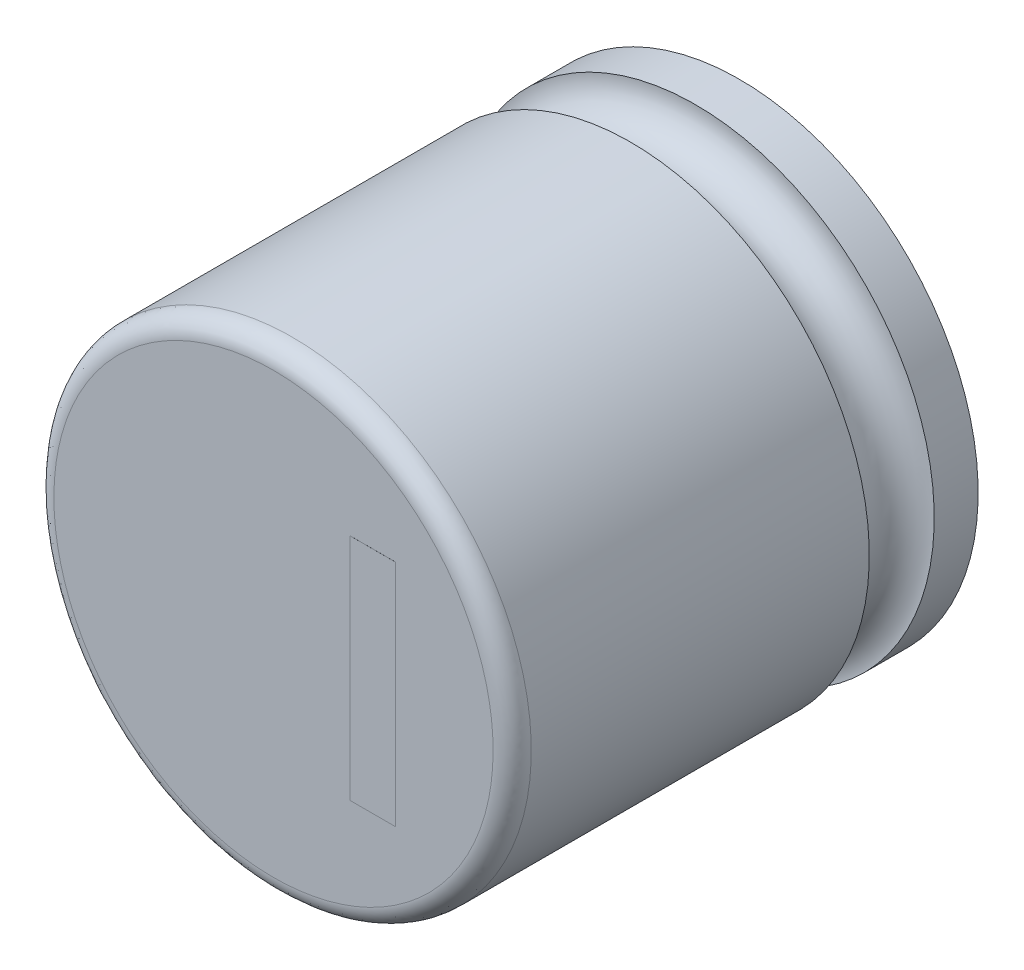
ISO-10303-21;
HEADER;
FILE_DESCRIPTION(('STEP AP214'),'2;1');
FILE_NAME('part.step','',(''),(''),'','','');
FILE_SCHEMA(('AUTOMOTIVE_DESIGN { 1 0 10303 214 1 1 1 1 }'));
ENDSEC;
DATA;
#1=APPLICATION_CONTEXT('core data for automotive mechanical design processes');
#2=APPLICATION_PROTOCOL_DEFINITION('international standard','automotive_design',2000,#1);
#3=PRODUCT_CONTEXT('',#1,'mechanical');
#4=PRODUCT('Part','Part','',(#3));
#5=PRODUCT_RELATED_PRODUCT_CATEGORY('part','',(#4));
#6=PRODUCT_DEFINITION_FORMATION('','',#4);
#7=PRODUCT_DEFINITION_CONTEXT('part definition',#1,'design');
#8=PRODUCT_DEFINITION('design','',#6,#7);
#9=PRODUCT_DEFINITION_SHAPE('','',#8);
#10=(LENGTH_UNIT() NAMED_UNIT(*) SI_UNIT(.MILLI.,.METRE.));
#11=(NAMED_UNIT(*) PLANE_ANGLE_UNIT() SI_UNIT($,.RADIAN.));
#12=(NAMED_UNIT(*) SI_UNIT($,.STERADIAN.) SOLID_ANGLE_UNIT());
#13=UNCERTAINTY_MEASURE_WITH_UNIT(LENGTH_MEASURE(1.E-05),#10,'distance_accuracy_value','');
#14=(GEOMETRIC_REPRESENTATION_CONTEXT(3) GLOBAL_UNCERTAINTY_ASSIGNED_CONTEXT((#13)) GLOBAL_UNIT_ASSIGNED_CONTEXT((#10,
#11,#12)) REPRESENTATION_CONTEXT('',''));
#15=CARTESIAN_POINT('',(0.,0.,0.));
#16=DIRECTION('',(0.,0.,1.));
#17=DIRECTION('',(1.,0.,0.));
#18=AXIS2_PLACEMENT_3D('',#15,#16,#17);
#19=CARTESIAN_POINT('',(0.,0.,13.5));
#20=DIRECTION('',(0.,0.,-1.));
#21=DIRECTION('',(-1.,0.,0.));
#22=AXIS2_PLACEMENT_3D('',#19,#20,#21);
#23=CYLINDRICAL_SURFACE('',#22,6.25);
#24=CARTESIAN_POINT('',(0.,0.,4.15));
#25=DIRECTION('',(0.,0.,1.));
#26=DIRECTION('',(-1.,0.,0.));
#27=AXIS2_PLACEMENT_3D('',#24,#25,#26);
#28=CIRCLE('',#27,6.25);
#29=CARTESIAN_POINT('',(-6.25,0.,4.15));
#30=VERTEX_POINT('',#29);
#31=EDGE_CURVE('E30',#30,#30,#28,.T.);
#32=ORIENTED_EDGE('',*,*,#31,.T.);
#33=CARTESIAN_POINT('',(-6.25,0.,13.));
#34=CARTESIAN_POINT('',(-6.25,0.,4.15));
#35=(BOUNDED_CURVE() B_SPLINE_CURVE(1,(#33,#34),.UNSPECIFIED.,.F.,
.F.) B_SPLINE_CURVE_WITH_KNOTS((2,2),(0.5,9.35),
.UNSPECIFIED.) CURVE() GEOMETRIC_REPRESENTATION_ITEM() RATIONAL_B_SPLINE_CURVE((1.,1.)) REPRESENTATION_ITEM(''));
#36=CARTESIAN_POINT('',(-6.25,0.,13.));
#37=VERTEX_POINT('',#36);
#38=EDGE_CURVE('E11',#37,#30,#35,.T.);
#39=ORIENTED_EDGE('',*,*,#38,.F.);
#40=CARTESIAN_POINT('',(0.,0.,13.));
#41=DIRECTION('',(0.,0.,-1.));
#42=DIRECTION('',(-1.,0.,0.));
#43=AXIS2_PLACEMENT_3D('',#40,#41,#42);
#44=CIRCLE('',#43,6.25);
#45=EDGE_CURVE('E84',#37,#37,#44,.T.);
#46=ORIENTED_EDGE('',*,*,#45,.T.);
#47=ORIENTED_EDGE('',*,*,#38,.T.);
#48=EDGE_LOOP('',(#32,#39,#46,#47));
#49=FACE_BOUND('',#48,.T.);
#50=ADVANCED_FACE('F17',(#49),#23,.T.);
#51=CARTESIAN_POINT('',(-6.25000000000044,0.,4.1500000000001));
#52=CARTESIAN_POINT('',(-5.72922726753655,0.,4.17978275430787));
#53=CARTESIAN_POINT('',(-5.35000000000013,0.,3.82162366830148));
#54=CARTESIAN_POINT('',(-5.35,0.,3.30000000000022));
#55=CARTESIAN_POINT('',(-5.34999999999987,0.,2.77837633169895));
#56=CARTESIAN_POINT('',(-5.7292272675361,0.,2.42021724569237));
#57=CARTESIAN_POINT('',(-6.25,0.,2.44999999999989));
#58=(BOUNDED_CURVE() B_SPLINE_CURVE(3,(#51,#52,#53,#54,#55,#56,#57),.UNSPECIFIED.,.F.,
.F.) B_SPLINE_CURVE_WITH_KNOTS((4,3,4),(0.,0.5,1.),
.UNSPECIFIED.) CURVE() GEOMETRIC_REPRESENTATION_ITEM() RATIONAL_B_SPLINE_CURVE((1.,
0.791082355309114,0.791082355309114,1.,0.791082355309114,0.791082355309114,1.)) REPRESENTATION_ITEM(''));
#59=CARTESIAN_POINT('',(0.,0.,3.3));
#60=DIRECTION('',(0.,0.,1.));
#61=AXIS1_PLACEMENT('',#59,#60);
#62=SURFACE_OF_REVOLUTION('',#58,#61);
#63=CARTESIAN_POINT('',(0.,0.,2.45));
#64=DIRECTION('',(0.,0.,-1.));
#65=DIRECTION('',(-1.,0.,0.));
#66=AXIS2_PLACEMENT_3D('',#63,#64,#65);
#67=CIRCLE('',#66,6.25);
#68=CARTESIAN_POINT('',(-6.25,0.,2.45));
#69=VERTEX_POINT('',#68);
#70=EDGE_CURVE('E94',#69,#69,#67,.T.);
#71=ORIENTED_EDGE('',*,*,#70,.F.);
#72=CARTESIAN_POINT('',(-6.25,0.,4.15));
#73=CARTESIAN_POINT('',(-5.904066225975,0.,4.169783794266));
#74=CARTESIAN_POINT('',(-5.548924954291,0.,4.028619995499));
#75=CARTESIAN_POINT('',(-5.271943866977,0.,3.721884924388));
#76=CARTESIAN_POINT('',(-5.163392181809,0.,3.3));
#77=CARTESIAN_POINT('',(-5.271943866977,0.,2.878115075613));
#78=CARTESIAN_POINT('',(-5.548924954291,0.,2.571380004501));
#79=CARTESIAN_POINT('',(-5.904066225975,0.,2.430216205734));
#80=CARTESIAN_POINT('',(-6.25,0.,2.45));
#81=(BOUNDED_CURVE() B_SPLINE_CURVE(8,(#72,#73,#74,#75,#76,#77,#78,#79,#80),.UNSPECIFIED.,.F.,
.F.) B_SPLINE_CURVE_WITH_KNOTS((9,9),(1.513669011117,4.769516296062),
.UNSPECIFIED.) CURVE() GEOMETRIC_REPRESENTATION_ITEM() RATIONAL_B_SPLINE_CURVE((1.,1.,1.,1.,1.,
1.,1.,1.,1.)) REPRESENTATION_ITEM(''));
#82=EDGE_CURVE('E112',#30,#69,#81,.T.);
#83=ORIENTED_EDGE('',*,*,#82,.F.);
#84=ORIENTED_EDGE('',*,*,#31,.F.);
#85=ORIENTED_EDGE('',*,*,#82,.T.);
#86=EDGE_LOOP('',(#71,#83,#84,#85));
#87=FACE_BOUND('',#86,.T.);
#88=ADVANCED_FACE('F152',(#87),#62,.F.);
#89=CARTESIAN_POINT('',(5.74518436897133,0.,13.49997680916));
#90=CARTESIAN_POINT('',(6.04030555429083,0.,13.5028193304754));
#91=CARTESIAN_POINT('',(6.25,0.,13.2951348741708));
#92=CARTESIAN_POINT('',(6.25,0.,13.));
#93=(BOUNDED_CURVE() B_SPLINE_CURVE(3,(#89,#90,#91,#92),.UNSPECIFIED.,.F.,
.F.) B_SPLINE_CURVE_WITH_KNOTS((4,4),(0.,1.),
.UNSPECIFIED.) CURVE() GEOMETRIC_REPRESENTATION_ITEM() RATIONAL_B_SPLINE_CURVE((1.,
0.802462251398544,0.802462251398544,1.)) REPRESENTATION_ITEM(''));
#94=CARTESIAN_POINT('',(0.,0.,13.));
#95=DIRECTION('',(0.,0.,-1.));
#96=AXIS1_PLACEMENT('',#94,#95);
#97=SURFACE_OF_REVOLUTION('',#93,#96);
#98=CARTESIAN_POINT('',(5.75,0.,13.5));
#99=CARTESIAN_POINT('',(5.75,-0.527813910733,13.5));
#100=CARTESIAN_POINT('',(5.654005868395,-1.04628755137,13.5));
#101=CARTESIAN_POINT('',(5.552063118885,-1.596890255842,13.5));
#102=CARTESIAN_POINT('',(5.346282731109,-2.116544579981,13.5));
#103=CARTESIAN_POINT('',(5.131467410302,-2.659014693654,13.5));
#104=CARTESIAN_POINT('',(4.812724189507,-3.146456081965,13.5));
#105=CARTESIAN_POINT('',(4.486558664155,-3.645248106782,13.5));
#106=CARTESIAN_POINT('',(4.065863991823,-4.065863991823,13.5));
#107=CARTESIAN_POINT('',(3.644411809205,-4.487237245284,13.5));
#108=CARTESIAN_POINT('',(3.146456081965,-4.812724189507,13.5));
#109=CARTESIAN_POINT('',(2.658077636135,-5.131950978681,13.5));
#110=CARTESIAN_POINT('',(2.116544579981,-5.346282731109,13.5));
#111=CARTESIAN_POINT('',(1.59588135768,-5.552354474269,13.5));
#112=CARTESIAN_POINT('',(1.04628755137,-5.654005868395,13.5));
#113=CARTESIAN_POINT('',(0.527017785792,-5.750048609403,13.5));
#114=CARTESIAN_POINT('',(0.,-5.75,13.5));
#115=CARTESIAN_POINT('',(-0.528076982508,-5.749951292902,13.5));
#116=CARTESIAN_POINT('',(-1.04628755137,-5.654005868395,13.5));
#117=CARTESIAN_POINT('',(-1.596890255842,-5.552063118885,13.5));
#118=CARTESIAN_POINT('',(-2.116544579981,-5.346282731109,13.5));
#119=CARTESIAN_POINT('',(-2.659014693653,-5.131467410303,13.5));
#120=CARTESIAN_POINT('',(-3.146456081965,-4.812724189507,13.5));
#121=CARTESIAN_POINT('',(-3.645248106781,-4.486558664155,13.5));
#122=CARTESIAN_POINT('',(-4.065863991823,-4.065863991823,13.5));
#123=CARTESIAN_POINT('',(-4.487237245281,-3.644411809208,13.5));
#124=CARTESIAN_POINT('',(-4.812724189507,-3.146456081965,13.5));
#125=CARTESIAN_POINT('',(-5.131950978682,-2.658077636135,13.5));
#126=CARTESIAN_POINT('',(-5.346282731109,-2.116544579981,13.5));
#127=CARTESIAN_POINT('',(-5.552354474269,-1.595881357678,13.5));
#128=CARTESIAN_POINT('',(-5.654005868395,-1.04628755137,13.5));
#129=CARTESIAN_POINT('',(-5.75,-0.527280599962,13.5));
#130=CARTESIAN_POINT('',(-5.75,0.,13.5));
#131=(BOUNDED_CURVE() B_SPLINE_CURVE(2,(#98,#99,#100,#101,#102,#103,#104,#105,#106,#107,#108,
#109,#110,#111,#112,#113,#114,#115,#116,#117,#118,#119,#120,#121,#122,#123,#124,#125,#126,#127,
#128,#129,#130),.UNSPECIFIED.,.F.,.F.) B_SPLINE_CURVE_WITH_KNOTS((3,2,2,2,2,2,2,2,2,2,2,2,2,2,2,
2,3),(0.,0.0625,0.125,0.1875,0.25,0.3125,0.375,0.4375,0.5,0.5625,0.625,0.6875,0.75,0.8125,0.875,
0.9375,1.),.UNSPECIFIED.) CURVE() GEOMETRIC_REPRESENTATION_ITEM() RATIONAL_B_SPLINE_CURVE((1.,
1.,1.,1.,1.,1.,1.,1.,1.,1.,1.,1.,1.,1.,1.,1.,1.,1.,1.,1.,1.,1.,1.,1.,1.,1.,1.,1.,1.,1.,1.,1.,1.)) REPRESENTATION_ITEM(''));
#132=CARTESIAN_POINT('',(5.75,0.,13.5));
#133=VERTEX_POINT('',#132);
#134=CARTESIAN_POINT('',(-5.75,0.,13.5));
#135=VERTEX_POINT('',#134);
#136=EDGE_CURVE('E86',#133,#135,#131,.T.);
#137=ORIENTED_EDGE('',*,*,#136,.T.);
#138=CARTESIAN_POINT('',(-5.75,0.,13.5));
#139=CARTESIAN_POINT('',(-5.8808996939,0.,13.5));
#140=CARTESIAN_POINT('',(-6.011788250353,0.,13.45888615699));
#141=CARTESIAN_POINT('',(-6.12659507482,0.,13.37659507482));
#142=CARTESIAN_POINT('',(-6.20888615699,0.,13.261788250352));
#143=CARTESIAN_POINT('',(-6.25,0.,13.1308996939));
#144=CARTESIAN_POINT('',(-6.25,0.,13.));
#145=(BOUNDED_CURVE() B_SPLINE_CURVE(6,(#138,#139,#140,#141,#142,#143,#144),.UNSPECIFIED.,.F.,
.F.) B_SPLINE_CURVE_WITH_KNOTS((7,7),(4.712388980385,6.28318530718),
.UNSPECIFIED.) CURVE() GEOMETRIC_REPRESENTATION_ITEM() RATIONAL_B_SPLINE_CURVE((1.,1.,1.,1.,1.,
1.,1.)) REPRESENTATION_ITEM(''));
#146=EDGE_CURVE('E80',#135,#37,#145,.T.);
#147=ORIENTED_EDGE('',*,*,#146,.T.);
#148=ORIENTED_EDGE('',*,*,#45,.F.);
#149=ORIENTED_EDGE('',*,*,#146,.F.);
#150=CARTESIAN_POINT('',(-5.75,0.,13.5));
#151=CARTESIAN_POINT('',(-5.75,0.527813910736,13.5));
#152=CARTESIAN_POINT('',(-5.654005868395,1.04628755137,13.5));
#153=CARTESIAN_POINT('',(-5.552063118884,1.596890255847,13.5));
#154=CARTESIAN_POINT('',(-5.346282731109,2.116544579981,13.5));
#155=CARTESIAN_POINT('',(-5.1314674103,2.659014693657,13.5));
#156=CARTESIAN_POINT('',(-4.812724189507,3.146456081964,13.5));
#157=CARTESIAN_POINT('',(-4.486558664156,3.64524810678,13.5));
#158=CARTESIAN_POINT('',(-4.065863991823,4.065863991823,13.5));
#159=CARTESIAN_POINT('',(-3.644411809209,4.48723724528,13.5));
#160=CARTESIAN_POINT('',(-3.146456081965,4.812724189507,13.5));
#161=CARTESIAN_POINT('',(-2.658077636136,5.131950978681,13.5));
#162=CARTESIAN_POINT('',(-2.116544579981,5.346282731109,13.5));
#163=CARTESIAN_POINT('',(-1.595881357675,5.55235447427,13.5));
#164=CARTESIAN_POINT('',(-1.04628755137,5.654005868395,13.5));
#165=CARTESIAN_POINT('',(-0.527017785789,5.750048609403,13.5));
#166=CARTESIAN_POINT('',(0.,5.75,13.5));
#167=CARTESIAN_POINT('',(0.528076982512,5.749951292902,13.5));
#168=CARTESIAN_POINT('',(1.04628755137,5.654005868395,13.5));
#169=CARTESIAN_POINT('',(1.596890255851,5.552063118882,13.5));
#170=CARTESIAN_POINT('',(2.116544579981,5.346282731109,13.5));
#171=CARTESIAN_POINT('',(2.659014693658,5.131467410299,13.5));
#172=CARTESIAN_POINT('',(3.146456081965,4.812724189507,13.5));
#173=CARTESIAN_POINT('',(3.64524810678,4.486558664155,13.5));
#174=CARTESIAN_POINT('',(4.065863991823,4.065863991823,13.5));
#175=CARTESIAN_POINT('',(4.487237245281,3.644411809208,13.5));
#176=CARTESIAN_POINT('',(4.812724189507,3.146456081965,13.5));
#177=CARTESIAN_POINT('',(5.131950978685,2.65807763613,13.5));
#178=CARTESIAN_POINT('',(5.346282731109,2.116544579981,13.5));
#179=CARTESIAN_POINT('',(5.552354474272,1.595881357669,13.5));
#180=CARTESIAN_POINT('',(5.654005868395,1.04628755137,13.5));
#181=CARTESIAN_POINT('',(5.75,0.527280599957,13.5));
#182=CARTESIAN_POINT('',(5.75,0.,13.5));
#183=(BOUNDED_CURVE() B_SPLINE_CURVE(2,(#150,#151,#152,#153,#154,#155,#156,#157,#158,#159,#160,
#161,#162,#163,#164,#165,#166,#167,#168,#169,#170,#171,#172,#173,#174,#175,#176,#177,#178,#179,
#180,#181,#182),.UNSPECIFIED.,.F.,.F.) B_SPLINE_CURVE_WITH_KNOTS((3,2,2,2,2,2,2,2,2,2,2,2,2,2,2,
2,3),(0.,0.0625,0.125,0.1875,0.25,0.3125,0.375,0.4375,0.5,0.5625,0.625,0.6875,0.75,0.8125,0.875,
0.9375,1.),.UNSPECIFIED.) CURVE() GEOMETRIC_REPRESENTATION_ITEM() RATIONAL_B_SPLINE_CURVE((1.,
1.,1.,1.,1.,1.,1.,1.,1.,1.,1.,1.,1.,1.,1.,1.,1.,1.,1.,1.,1.,1.,1.,1.,1.,1.,1.,1.,1.,1.,1.,1.,1.)) REPRESENTATION_ITEM(''));
#184=EDGE_CURVE('E83',#135,#133,#183,.T.);
#185=ORIENTED_EDGE('',*,*,#184,.T.);
#186=EDGE_LOOP('',(#137,#147,#148,#149,#185));
#187=FACE_BOUND('',#186,.T.);
#188=ADVANCED_FACE('F19',(#187),#97,.T.);
#189=CARTESIAN_POINT('',(-6.25,0.,13.5));
#190=DIRECTION('',(0.,0.,1.));
#191=DIRECTION('',(0.,-1.,0.));
#192=AXIS2_PLACEMENT_3D('',#189,#190,#191);
#193=PLANE('',#192);
#194=ORIENTED_EDGE('',*,*,#184,.F.);
#195=ORIENTED_EDGE('',*,*,#136,.F.);
#196=EDGE_LOOP('',(#194,#195));
#197=FACE_BOUND('',#196,.T.);
#198=DIRECTION('',(1.,0.,0.));
#199=VECTOR('',#198,1.);
#200=CARTESIAN_POINT('',(-6.25,3.,13.5));
#201=LINE('',#200,#199);
#202=CARTESIAN_POINT('',(2.,3.,13.5));
#203=VERTEX_POINT('',#202);
#204=CARTESIAN_POINT('',(3.2,3.,13.5));
#205=VERTEX_POINT('',#204);
#206=EDGE_CURVE('E145',#203,#205,#201,.T.);
#207=ORIENTED_EDGE('',*,*,#206,.T.);
#208=DIRECTION('',(0.,-1.,0.));
#209=VECTOR('',#208,1.);
#210=CARTESIAN_POINT('',(3.2,0.,13.5));
#211=LINE('',#210,#209);
#212=CARTESIAN_POINT('',(3.2,-3.,13.5));
#213=VERTEX_POINT('',#212);
#214=EDGE_CURVE('E123',#205,#213,#211,.T.);
#215=ORIENTED_EDGE('',*,*,#214,.T.);
#216=DIRECTION('',(-1.,0.,0.));
#217=VECTOR('',#216,1.);
#218=CARTESIAN_POINT('',(-6.25,-3.,13.5));
#219=LINE('',#218,#217);
#220=CARTESIAN_POINT('',(2.,-3.,13.5));
#221=VERTEX_POINT('',#220);
#222=EDGE_CURVE('E133',#213,#221,#219,.T.);
#223=ORIENTED_EDGE('',*,*,#222,.T.);
#224=DIRECTION('',(0.,1.,0.));
#225=VECTOR('',#224,1.);
#226=CARTESIAN_POINT('',(2.,0.,13.5));
#227=LINE('',#226,#225);
#228=EDGE_CURVE('E107',#221,#203,#227,.T.);
#229=ORIENTED_EDGE('',*,*,#228,.T.);
#230=EDGE_LOOP('',(#207,#215,#223,#229));
#231=FACE_BOUND('',#230,.T.);
#232=ADVANCED_FACE('F91',(#197,#231),#193,.T.);
#233=CARTESIAN_POINT('',(0.,0.,13.5));
#234=DIRECTION('',(0.,0.,-1.));
#235=DIRECTION('',(-1.,0.,0.));
#236=AXIS2_PLACEMENT_3D('',#233,#234,#235);
#237=CYLINDRICAL_SURFACE('',#236,6.25);
#238=CARTESIAN_POINT('',(0.,0.,1.3));
#239=DIRECTION('',(0.,0.,1.));
#240=DIRECTION('',(-1.,0.,0.));
#241=AXIS2_PLACEMENT_3D('',#238,#239,#240);
#242=CIRCLE('',#241,6.25);
#243=CARTESIAN_POINT('',(-6.25,0.,1.3));
#244=VERTEX_POINT('',#243);
#245=EDGE_CURVE('E132',#244,#244,#242,.T.);
#246=ORIENTED_EDGE('',*,*,#245,.T.);
#247=CARTESIAN_POINT('',(-6.25,0.,2.45));
#248=CARTESIAN_POINT('',(-6.25,0.,1.3));
#249=(BOUNDED_CURVE() B_SPLINE_CURVE(1,(#247,#248),.UNSPECIFIED.,.F.,
.F.) B_SPLINE_CURVE_WITH_KNOTS((2,2),(11.05,12.2),
.UNSPECIFIED.) CURVE() GEOMETRIC_REPRESENTATION_ITEM() RATIONAL_B_SPLINE_CURVE((1.,1.)) REPRESENTATION_ITEM(''));
#250=EDGE_CURVE('E101',#69,#244,#249,.T.);
#251=ORIENTED_EDGE('',*,*,#250,.F.);
#252=ORIENTED_EDGE('',*,*,#70,.T.);
#253=ORIENTED_EDGE('',*,*,#250,.T.);
#254=EDGE_LOOP('',(#246,#251,#252,#253));
#255=FACE_BOUND('',#254,.T.);
#256=ADVANCED_FACE('F158',(#255),#237,.T.);
#257=CARTESIAN_POINT('',(3.2,3.,13.501));
#258=DIRECTION('',(-1.,0.,0.));
#259=DIRECTION('',(0.,1.,0.));
#260=AXIS2_PLACEMENT_3D('',#257,#258,#259);
#261=PLANE('',#260);
#262=DIRECTION('',(0.,0.,-1.));
#263=VECTOR('',#262,1.);
#264=CARTESIAN_POINT('',(3.2,3.,13.501));
#265=LINE('',#264,#263);
#266=CARTESIAN_POINT('',(3.2,3.,13.501));
#267=VERTEX_POINT('',#266);
#268=EDGE_CURVE('E221',#267,#205,#265,.T.);
#269=ORIENTED_EDGE('',*,*,#268,.F.);
#270=DIRECTION('',(0.,1.,0.));
#271=VECTOR('',#270,1.);
#272=CARTESIAN_POINT('',(3.2,3.,13.501));
#273=LINE('',#272,#271);
#274=CARTESIAN_POINT('',(3.2,-3.,13.501));
#275=VERTEX_POINT('',#274);
#276=EDGE_CURVE('E143',#275,#267,#273,.T.);
#277=ORIENTED_EDGE('',*,*,#276,.F.);
#278=DIRECTION('',(0.,0.,1.));
#279=VECTOR('',#278,1.);
#280=CARTESIAN_POINT('',(3.2,-3.,13.501));
#281=LINE('',#280,#279);
#282=EDGE_CURVE('E124',#213,#275,#281,.T.);
#283=ORIENTED_EDGE('',*,*,#282,.F.);
#284=ORIENTED_EDGE('',*,*,#214,.F.);
#285=EDGE_LOOP('',(#269,#277,#283,#284));
#286=FACE_BOUND('',#285,.T.);
#287=ADVANCED_FACE('F167',(#286),#261,.F.);
#288=CARTESIAN_POINT('',(2.,3.,13.501));
#289=DIRECTION('',(0.,-1.,0.));
#290=DIRECTION('',(0.,0.,-1.));
#291=AXIS2_PLACEMENT_3D('',#288,#289,#290);
#292=PLANE('',#291);
#293=DIRECTION('',(0.,0.,-1.));
#294=VECTOR('',#293,1.);
#295=CARTESIAN_POINT('',(2.,3.,13.501));
#296=LINE('',#295,#294);
#297=CARTESIAN_POINT('',(2.,3.,13.501));
#298=VERTEX_POINT('',#297);
#299=EDGE_CURVE('E137',#298,#203,#296,.T.);
#300=ORIENTED_EDGE('',*,*,#299,.F.);
#301=DIRECTION('',(-1.,0.,0.));
#302=VECTOR('',#301,1.);
#303=CARTESIAN_POINT('',(2.,3.,13.501));
#304=LINE('',#303,#302);
#305=EDGE_CURVE('E138',#267,#298,#304,.T.);
#306=ORIENTED_EDGE('',*,*,#305,.F.);
#307=ORIENTED_EDGE('',*,*,#268,.T.);
#308=ORIENTED_EDGE('',*,*,#206,.F.);
#309=EDGE_LOOP('',(#300,#306,#307,#308));
#310=FACE_BOUND('',#309,.T.);
#311=ADVANCED_FACE('F163',(#310),#292,.F.);
#312=CARTESIAN_POINT('',(2.,3.,13.501));
#313=DIRECTION('',(1.,0.,0.));
#314=DIRECTION('',(0.,1.,0.));
#315=AXIS2_PLACEMENT_3D('',#312,#313,#314);
#316=PLANE('',#315);
#317=DIRECTION('',(0.,0.,-1.));
#318=VECTOR('',#317,1.);
#319=CARTESIAN_POINT('',(2.,-3.,13.501));
#320=LINE('',#319,#318);
#321=CARTESIAN_POINT('',(2.,-3.,13.501));
#322=VERTEX_POINT('',#321);
#323=EDGE_CURVE('E131',#322,#221,#320,.T.);
#324=ORIENTED_EDGE('',*,*,#323,.F.);
#325=DIRECTION('',(0.,-1.,0.));
#326=VECTOR('',#325,1.);
#327=CARTESIAN_POINT('',(2.,3.,13.501));
#328=LINE('',#327,#326);
#329=EDGE_CURVE('E142',#298,#322,#328,.T.);
#330=ORIENTED_EDGE('',*,*,#329,.F.);
#331=ORIENTED_EDGE('',*,*,#299,.T.);
#332=ORIENTED_EDGE('',*,*,#228,.F.);
#333=EDGE_LOOP('',(#324,#330,#331,#332));
#334=FACE_BOUND('',#333,.T.);
#335=ADVANCED_FACE('F159',(#334),#316,.F.);
#336=CARTESIAN_POINT('',(2.,-3.,13.501));
#337=DIRECTION('',(0.,1.,0.));
#338=DIRECTION('',(1.,0.,0.));
#339=AXIS2_PLACEMENT_3D('',#336,#337,#338);
#340=PLANE('',#339);
#341=ORIENTED_EDGE('',*,*,#282,.T.);
#342=DIRECTION('',(1.,0.,0.));
#343=VECTOR('',#342,1.);
#344=CARTESIAN_POINT('',(2.,-3.,13.501));
#345=LINE('',#344,#343);
#346=EDGE_CURVE('E199',#322,#275,#345,.T.);
#347=ORIENTED_EDGE('',*,*,#346,.F.);
#348=ORIENTED_EDGE('',*,*,#323,.T.);
#349=ORIENTED_EDGE('',*,*,#222,.F.);
#350=EDGE_LOOP('',(#341,#347,#348,#349));
#351=FACE_BOUND('',#350,.T.);
#352=ADVANCED_FACE('F162',(#351),#340,.F.);
#353=CARTESIAN_POINT('',(0.,0.,1.3));
#354=DIRECTION('',(0.,0.,-1.));
#355=DIRECTION('',(-1.,0.,0.));
#356=AXIS2_PLACEMENT_3D('',#353,#354,#355);
#357=PLANE('',#356);
#358=ORIENTED_EDGE('',*,*,#245,.F.);
#359=EDGE_LOOP('',(#358));
#360=FACE_BOUND('',#359,.T.);
#361=ADVANCED_FACE('F171',(#360),#357,.T.);
#362=CARTESIAN_POINT('',(0.,0.,13.501));
#363=DIRECTION('',(0.,0.,1.));
#364=DIRECTION('',(0.,-1.,0.));
#365=AXIS2_PLACEMENT_3D('',#362,#363,#364);
#366=PLANE('',#365);
#367=ORIENTED_EDGE('',*,*,#276,.T.);
#368=ORIENTED_EDGE('',*,*,#305,.T.);
#369=ORIENTED_EDGE('',*,*,#329,.T.);
#370=ORIENTED_EDGE('',*,*,#346,.T.);
#371=EDGE_LOOP('',(#367,#368,#369,#370));
#372=FACE_BOUND('',#371,.T.);
#373=ADVANCED_FACE('F174',(#372),#366,.T.);
#374=CLOSED_SHELL('',(#50,#88,#188,#232,#256,#287,#311,#335,#352,#361,#373));
#375=MANIFOLD_SOLID_BREP('B1',#374);
#376=ADVANCED_BREP_SHAPE_REPRESENTATION('',(#18,#375),#14);
#377=SHAPE_DEFINITION_REPRESENTATION(#9,#376);
ENDSEC;
END-ISO-10303-21;
